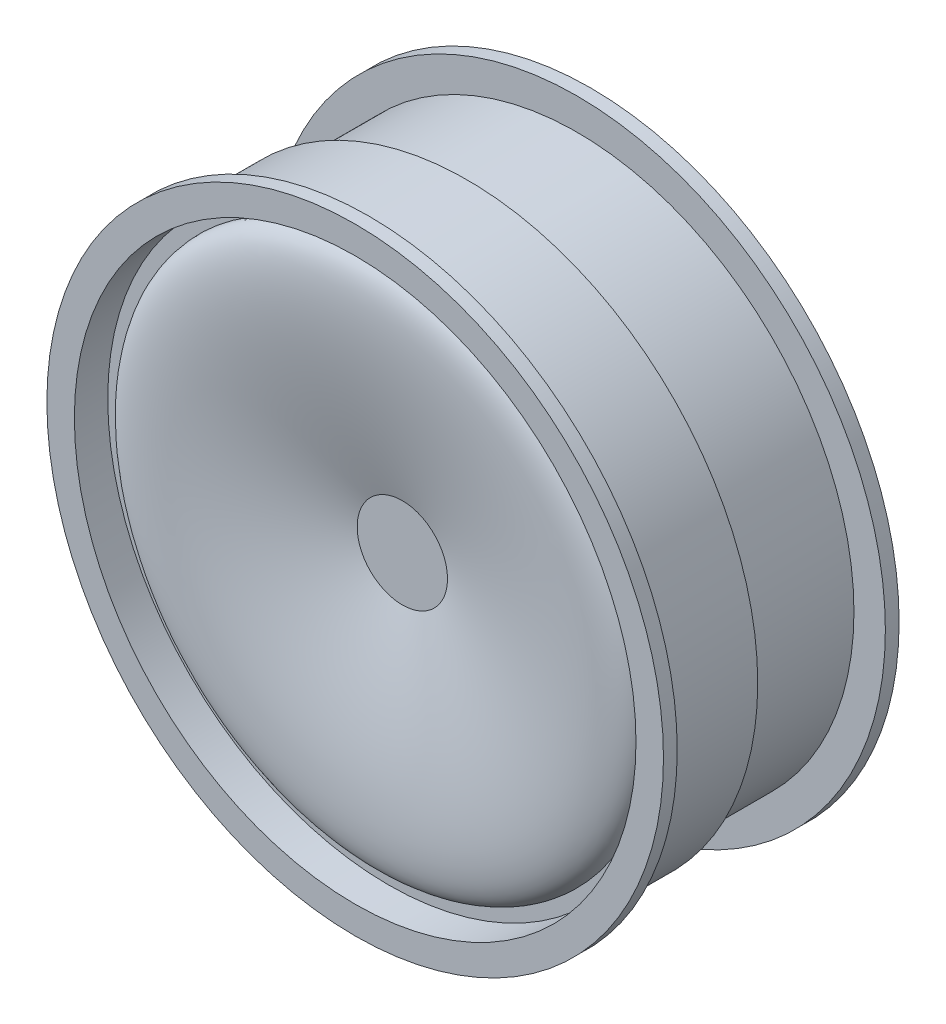
ISO-10303-21;
HEADER;
FILE_DESCRIPTION(('STEP AP214'),'2;1');
FILE_NAME('part.step','',(''),(''),'','','');
FILE_SCHEMA(('AUTOMOTIVE_DESIGN { 1 0 10303 214 1 1 1 1 }'));
ENDSEC;
DATA;
#1=APPLICATION_CONTEXT('core data for automotive mechanical design processes');
#2=APPLICATION_PROTOCOL_DEFINITION('international standard','automotive_design',2000,#1);
#3=PRODUCT_CONTEXT('',#1,'mechanical');
#4=PRODUCT('Part','Part','',(#3));
#5=PRODUCT_RELATED_PRODUCT_CATEGORY('part','',(#4));
#6=PRODUCT_DEFINITION_FORMATION('','',#4);
#7=PRODUCT_DEFINITION_CONTEXT('part definition',#1,'design');
#8=PRODUCT_DEFINITION('design','',#6,#7);
#9=PRODUCT_DEFINITION_SHAPE('','',#8);
#10=(LENGTH_UNIT() NAMED_UNIT(*) SI_UNIT(.MILLI.,.METRE.));
#11=(NAMED_UNIT(*) PLANE_ANGLE_UNIT() SI_UNIT($,.RADIAN.));
#12=(NAMED_UNIT(*) SI_UNIT($,.STERADIAN.) SOLID_ANGLE_UNIT());
#13=UNCERTAINTY_MEASURE_WITH_UNIT(LENGTH_MEASURE(1.E-05),#10,'distance_accuracy_value','');
#14=(GEOMETRIC_REPRESENTATION_CONTEXT(3) GLOBAL_UNCERTAINTY_ASSIGNED_CONTEXT((#13)) GLOBAL_UNIT_ASSIGNED_CONTEXT((#10,
#11,#12)) REPRESENTATION_CONTEXT('',''));
#15=CARTESIAN_POINT('',(0.,0.,0.));
#16=DIRECTION('',(0.,0.,1.));
#17=DIRECTION('',(1.,0.,0.));
#18=AXIS2_PLACEMENT_3D('',#15,#16,#17);
#19=CARTESIAN_POINT('',(0.,34.,1.75375434852594));
#20=CARTESIAN_POINT('',(0.,34.,4.));
#21=CARTESIAN_POINT('',(0.,30.,7.5));
#22=CARTESIAN_POINT('',(0.,5.75,0.));
#23=B_SPLINE_CURVE_WITH_KNOTS('',3,(#19,#20,#21,#22),.UNSPECIFIED.,.F.,.F.,(4,4),(0.,1.),.UNSPECIFIED.);
#24=CARTESIAN_POINT('',(0.,0.,0.));
#25=DIRECTION('',(0.,0.,1.));
#26=AXIS1_PLACEMENT('',#24,#25);
#27=SURFACE_OF_REVOLUTION('',#23,#26);
#28=CARTESIAN_POINT('',(0.,0.,0.));
#29=DIRECTION('',(0.,0.,1.));
#30=DIRECTION('',(1.,0.,0.));
#31=AXIS2_PLACEMENT_3D('',#28,#29,#30);
#32=CIRCLE('',#31,5.75);
#33=CARTESIAN_POINT('',(5.75,0.,0.));
#34=VERTEX_POINT('',#33);
#35=EDGE_CURVE('E10',#34,#34,#32,.T.);
#36=ORIENTED_EDGE('',*,*,#35,.F.);
#37=EDGE_LOOP('',(#36));
#38=FACE_BOUND('',#37,.T.);
#39=CARTESIAN_POINT('',(0.,0.,1.75375434852594));
#40=DIRECTION('',(0.,0.,1.));
#41=DIRECTION('',(1.,0.,0.));
#42=AXIS2_PLACEMENT_3D('',#39,#40,#41);
#43=CIRCLE('',#42,34.);
#44=CARTESIAN_POINT('',(34.,0.,1.75375434852594));
#45=VERTEX_POINT('',#44);
#46=EDGE_CURVE('E81',#45,#45,#43,.T.);
#47=ORIENTED_EDGE('',*,*,#46,.T.);
#48=EDGE_LOOP('',(#47));
#49=FACE_BOUND('',#48,.T.);
#50=ADVANCED_FACE('F31',(#38,#49),#27,.T.);
#51=CARTESIAN_POINT('',(0.,5.75,0.));
#52=DIRECTION('',(0.,0.,-1.));
#53=DIRECTION('',(-1.,0.,0.));
#54=AXIS2_PLACEMENT_3D('',#51,#52,#53);
#55=PLANE('',#54);
#56=ORIENTED_EDGE('',*,*,#35,.T.);
#57=EDGE_LOOP('',(#56));
#58=FACE_BOUND('',#57,.T.);
#59=ADVANCED_FACE('F103',(#58),#55,.F.);
#60=CARTESIAN_POINT('',(0.,0.,-2.20876288659794));
#61=DIRECTION('',(0.,0.,1.));
#62=DIRECTION('',(1.,0.,0.));
#63=AXIS2_PLACEMENT_3D('',#60,#61,#62);
#64=PLANE('',#63);
#65=CARTESIAN_POINT('',(0.,0.,-2.20876288659794));
#66=DIRECTION('',(0.,0.,1.));
#67=DIRECTION('',(1.,0.,0.));
#68=AXIS2_PLACEMENT_3D('',#65,#66,#67);
#69=CIRCLE('',#68,7.5);
#70=CARTESIAN_POINT('',(7.5,0.,-2.20876288659794));
#71=VERTEX_POINT('',#70);
#72=EDGE_CURVE('E38',#71,#71,#69,.T.);
#73=ORIENTED_EDGE('',*,*,#72,.F.);
#74=EDGE_LOOP('',(#73));
#75=FACE_BOUND('',#74,.T.);
#76=ADVANCED_FACE('F99',(#75),#64,.F.);
#77=CARTESIAN_POINT('',(0.,7.5,-2.20876288659794));
#78=CARTESIAN_POINT('',(0.,30.,4.75));
#79=CARTESIAN_POINT('',(0.,32.5,2.));
#80=CARTESIAN_POINT('',(0.,32.5,-1.24624565147407));
#81=B_SPLINE_CURVE_WITH_KNOTS('',3,(#77,#78,#79,#80),.UNSPECIFIED.,.F.,.F.,(4,4),(0.,1.),.UNSPECIFIED.);
#82=CARTESIAN_POINT('',(0.,0.,0.));
#83=DIRECTION('',(0.,0.,1.));
#84=AXIS1_PLACEMENT('',#82,#83);
#85=SURFACE_OF_REVOLUTION('',#81,#84);
#86=CARTESIAN_POINT('',(0.,0.,-1.24624565147407));
#87=DIRECTION('',(0.,0.,1.));
#88=DIRECTION('',(1.,0.,0.));
#89=AXIS2_PLACEMENT_3D('',#86,#87,#88);
#90=CIRCLE('',#89,32.5);
#91=CARTESIAN_POINT('',(32.5,0.,-1.24624565147407));
#92=VERTEX_POINT('',#91);
#93=EDGE_CURVE('E42',#92,#92,#90,.T.);
#94=ORIENTED_EDGE('',*,*,#93,.F.);
#95=EDGE_LOOP('',(#94));
#96=FACE_BOUND('',#95,.T.);
#97=ORIENTED_EDGE('',*,*,#72,.T.);
#98=EDGE_LOOP('',(#97));
#99=FACE_BOUND('',#98,.T.);
#100=ADVANCED_FACE('F94',(#96,#99),#85,.T.);
#101=CARTESIAN_POINT('',(0.,0.,0.));
#102=DIRECTION('',(0.,0.,1.));
#103=DIRECTION('',(1.,0.,0.));
#104=AXIS2_PLACEMENT_3D('',#101,#102,#103);
#105=CYLINDRICAL_SURFACE('',#104,32.5);
#106=CARTESIAN_POINT('',(0.,0.,-23.9962456514741));
#107=DIRECTION('',(0.,0.,1.));
#108=DIRECTION('',(1.,0.,0.));
#109=AXIS2_PLACEMENT_3D('',#106,#107,#108);
#110=CIRCLE('',#109,32.5);
#111=CARTESIAN_POINT('',(32.5,0.,-23.9962456514741));
#112=VERTEX_POINT('',#111);
#113=EDGE_CURVE('E46',#112,#112,#110,.T.);
#114=ORIENTED_EDGE('',*,*,#113,.F.);
#115=EDGE_LOOP('',(#114));
#116=FACE_BOUND('',#115,.T.);
#117=ORIENTED_EDGE('',*,*,#93,.T.);
#118=EDGE_LOOP('',(#117));
#119=FACE_BOUND('',#118,.T.);
#120=ADVANCED_FACE('F98',(#116,#119),#105,.F.);
#121=CARTESIAN_POINT('',(0.,39.25,-23.9962456514741));
#122=DIRECTION('',(0.,0.,1.));
#123=DIRECTION('',(1.,0.,0.));
#124=AXIS2_PLACEMENT_3D('',#121,#122,#123);
#125=PLANE('',#124);
#126=CARTESIAN_POINT('',(0.,0.,-23.9962456514741));
#127=DIRECTION('',(0.,0.,1.));
#128=DIRECTION('',(1.,0.,0.));
#129=AXIS2_PLACEMENT_3D('',#126,#127,#128);
#130=CIRCLE('',#129,39.25);
#131=CARTESIAN_POINT('',(39.25,0.,-23.9962456514741));
#132=VERTEX_POINT('',#131);
#133=EDGE_CURVE('E51',#132,#132,#130,.T.);
#134=ORIENTED_EDGE('',*,*,#133,.F.);
#135=EDGE_LOOP('',(#134));
#136=FACE_BOUND('',#135,.T.);
#137=ORIENTED_EDGE('',*,*,#113,.T.);
#138=EDGE_LOOP('',(#137));
#139=FACE_BOUND('',#138,.T.);
#140=ADVANCED_FACE('F172',(#136,#139),#125,.F.);
#141=CARTESIAN_POINT('',(0.,0.,0.));
#142=DIRECTION('',(0.,0.,1.));
#143=DIRECTION('',(1.,0.,0.));
#144=AXIS2_PLACEMENT_3D('',#141,#142,#143);
#145=CYLINDRICAL_SURFACE('',#144,39.25);
#146=CARTESIAN_POINT('',(0.,0.,-22.2462456514741));
#147=DIRECTION('',(0.,0.,1.));
#148=DIRECTION('',(1.,0.,0.));
#149=AXIS2_PLACEMENT_3D('',#146,#147,#148);
#150=CIRCLE('',#149,39.25);
#151=CARTESIAN_POINT('',(39.25,0.,-22.2462456514741));
#152=VERTEX_POINT('',#151);
#153=EDGE_CURVE('E54',#152,#152,#150,.T.);
#154=ORIENTED_EDGE('',*,*,#153,.F.);
#155=EDGE_LOOP('',(#154));
#156=FACE_BOUND('',#155,.T.);
#157=ORIENTED_EDGE('',*,*,#133,.T.);
#158=EDGE_LOOP('',(#157));
#159=FACE_BOUND('',#158,.T.);
#160=ADVANCED_FACE('F166',(#156,#159),#145,.T.);
#161=CARTESIAN_POINT('',(0.,35.25,-22.2462456514741));
#162=DIRECTION('',(0.,0.,-1.));
#163=DIRECTION('',(-1.,0.,0.));
#164=AXIS2_PLACEMENT_3D('',#161,#162,#163);
#165=PLANE('',#164);
#166=CARTESIAN_POINT('',(0.,0.,-22.2462456514741));
#167=DIRECTION('',(0.,0.,1.));
#168=DIRECTION('',(1.,0.,0.));
#169=AXIS2_PLACEMENT_3D('',#166,#167,#168);
#170=CIRCLE('',#169,35.25);
#171=CARTESIAN_POINT('',(35.25,0.,-22.2462456514741));
#172=VERTEX_POINT('',#171);
#173=EDGE_CURVE('E57',#172,#172,#170,.T.);
#174=ORIENTED_EDGE('',*,*,#173,.F.);
#175=EDGE_LOOP('',(#174));
#176=FACE_BOUND('',#175,.T.);
#177=ORIENTED_EDGE('',*,*,#153,.T.);
#178=EDGE_LOOP('',(#177));
#179=FACE_BOUND('',#178,.T.);
#180=ADVANCED_FACE('F160',(#176,#179),#165,.F.);
#181=CARTESIAN_POINT('',(0.,0.,0.));
#182=DIRECTION('',(0.,0.,1.));
#183=DIRECTION('',(1.,0.,0.));
#184=AXIS2_PLACEMENT_3D('',#181,#182,#183);
#185=CYLINDRICAL_SURFACE('',#184,35.25);
#186=CARTESIAN_POINT('',(0.,0.,-8.24624565147406));
#187=DIRECTION('',(0.,0.,1.));
#188=DIRECTION('',(1.,0.,0.));
#189=AXIS2_PLACEMENT_3D('',#186,#187,#188);
#190=CIRCLE('',#189,35.25);
#191=CARTESIAN_POINT('',(35.25,0.,-8.24624565147406));
#192=VERTEX_POINT('',#191);
#193=EDGE_CURVE('E60',#192,#192,#190,.T.);
#194=ORIENTED_EDGE('',*,*,#193,.F.);
#195=EDGE_LOOP('',(#194));
#196=FACE_BOUND('',#195,.T.);
#197=ORIENTED_EDGE('',*,*,#173,.T.);
#198=EDGE_LOOP('',(#197));
#199=FACE_BOUND('',#198,.T.);
#200=ADVANCED_FACE('F154',(#196,#199),#185,.T.);
#201=CARTESIAN_POINT('',(0.,37.,-8.24624565147406));
#202=DIRECTION('',(0.,0.,1.));
#203=DIRECTION('',(1.,0.,0.));
#204=AXIS2_PLACEMENT_3D('',#201,#202,#203);
#205=PLANE('',#204);
#206=CARTESIAN_POINT('',(0.,0.,-8.24624565147406));
#207=DIRECTION('',(0.,0.,1.));
#208=DIRECTION('',(1.,0.,0.));
#209=AXIS2_PLACEMENT_3D('',#206,#207,#208);
#210=CIRCLE('',#209,37.);
#211=CARTESIAN_POINT('',(37.,0.,-8.24624565147406));
#212=VERTEX_POINT('',#211);
#213=EDGE_CURVE('E63',#212,#212,#210,.T.);
#214=ORIENTED_EDGE('',*,*,#213,.F.);
#215=EDGE_LOOP('',(#214));
#216=FACE_BOUND('',#215,.T.);
#217=ORIENTED_EDGE('',*,*,#193,.T.);
#218=EDGE_LOOP('',(#217));
#219=FACE_BOUND('',#218,.T.);
#220=ADVANCED_FACE('F148',(#216,#219),#205,.F.);
#221=CARTESIAN_POINT('',(0.,0.,0.));
#222=DIRECTION('',(0.,0.,1.));
#223=DIRECTION('',(1.,0.,0.));
#224=AXIS2_PLACEMENT_3D('',#221,#222,#223);
#225=CYLINDRICAL_SURFACE('',#224,37.);
#226=CARTESIAN_POINT('',(0.,0.,4.25375434852594));
#227=DIRECTION('',(0.,0.,1.));
#228=DIRECTION('',(1.,0.,0.));
#229=AXIS2_PLACEMENT_3D('',#226,#227,#228);
#230=CIRCLE('',#229,37.);
#231=CARTESIAN_POINT('',(37.,0.,4.25375434852594));
#232=VERTEX_POINT('',#231);
#233=EDGE_CURVE('E66',#232,#232,#230,.T.);
#234=ORIENTED_EDGE('',*,*,#233,.F.);
#235=EDGE_LOOP('',(#234));
#236=FACE_BOUND('',#235,.T.);
#237=ORIENTED_EDGE('',*,*,#213,.T.);
#238=EDGE_LOOP('',(#237));
#239=FACE_BOUND('',#238,.T.);
#240=ADVANCED_FACE('F142',(#236,#239),#225,.T.);
#241=CARTESIAN_POINT('',(0.,39.25,4.25375434852594));
#242=DIRECTION('',(0.,0.,1.));
#243=DIRECTION('',(1.,0.,0.));
#244=AXIS2_PLACEMENT_3D('',#241,#242,#243);
#245=PLANE('',#244);
#246=CARTESIAN_POINT('',(0.,0.,4.25375434852594));
#247=DIRECTION('',(0.,0.,1.));
#248=DIRECTION('',(1.,0.,0.));
#249=AXIS2_PLACEMENT_3D('',#246,#247,#248);
#250=CIRCLE('',#249,39.25);
#251=CARTESIAN_POINT('',(39.25,0.,4.25375434852594));
#252=VERTEX_POINT('',#251);
#253=EDGE_CURVE('E69',#252,#252,#250,.T.);
#254=ORIENTED_EDGE('',*,*,#253,.F.);
#255=EDGE_LOOP('',(#254));
#256=FACE_BOUND('',#255,.T.);
#257=ORIENTED_EDGE('',*,*,#233,.T.);
#258=EDGE_LOOP('',(#257));
#259=FACE_BOUND('',#258,.T.);
#260=ADVANCED_FACE('F136',(#256,#259),#245,.F.);
#261=CARTESIAN_POINT('',(0.,0.,0.));
#262=DIRECTION('',(0.,0.,1.));
#263=DIRECTION('',(1.,0.,0.));
#264=AXIS2_PLACEMENT_3D('',#261,#262,#263);
#265=CYLINDRICAL_SURFACE('',#264,39.25);
#266=CARTESIAN_POINT('',(0.,0.,6.00375434852594));
#267=DIRECTION('',(0.,0.,1.));
#268=DIRECTION('',(1.,0.,0.));
#269=AXIS2_PLACEMENT_3D('',#266,#267,#268);
#270=CIRCLE('',#269,39.25);
#271=CARTESIAN_POINT('',(39.25,0.,6.00375434852594));
#272=VERTEX_POINT('',#271);
#273=EDGE_CURVE('E72',#272,#272,#270,.T.);
#274=ORIENTED_EDGE('',*,*,#273,.F.);
#275=EDGE_LOOP('',(#274));
#276=FACE_BOUND('',#275,.T.);
#277=ORIENTED_EDGE('',*,*,#253,.T.);
#278=EDGE_LOOP('',(#277));
#279=FACE_BOUND('',#278,.T.);
#280=ADVANCED_FACE('F130',(#276,#279),#265,.T.);
#281=CARTESIAN_POINT('',(0.,35.75,6.00375434852594));
#282=DIRECTION('',(0.,0.,-1.));
#283=DIRECTION('',(-1.,0.,0.));
#284=AXIS2_PLACEMENT_3D('',#281,#282,#283);
#285=PLANE('',#284);
#286=CARTESIAN_POINT('',(0.,0.,6.00375434852594));
#287=DIRECTION('',(0.,0.,1.));
#288=DIRECTION('',(1.,0.,0.));
#289=AXIS2_PLACEMENT_3D('',#286,#287,#288);
#290=CIRCLE('',#289,35.75);
#291=CARTESIAN_POINT('',(35.75,0.,6.00375434852594));
#292=VERTEX_POINT('',#291);
#293=EDGE_CURVE('E75',#292,#292,#290,.T.);
#294=ORIENTED_EDGE('',*,*,#293,.F.);
#295=EDGE_LOOP('',(#294));
#296=FACE_BOUND('',#295,.T.);
#297=ORIENTED_EDGE('',*,*,#273,.T.);
#298=EDGE_LOOP('',(#297));
#299=FACE_BOUND('',#298,.T.);
#300=ADVANCED_FACE('F124',(#296,#299),#285,.F.);
#301=CARTESIAN_POINT('',(0.,0.,0.));
#302=DIRECTION('',(0.,0.,1.));
#303=DIRECTION('',(1.,0.,0.));
#304=AXIS2_PLACEMENT_3D('',#301,#302,#303);
#305=CYLINDRICAL_SURFACE('',#304,35.75);
#306=CARTESIAN_POINT('',(0.,0.,1.75375434852594));
#307=DIRECTION('',(0.,0.,1.));
#308=DIRECTION('',(1.,0.,0.));
#309=AXIS2_PLACEMENT_3D('',#306,#307,#308);
#310=CIRCLE('',#309,35.75);
#311=CARTESIAN_POINT('',(35.75,0.,1.75375434852594));
#312=VERTEX_POINT('',#311);
#313=EDGE_CURVE('E78',#312,#312,#310,.T.);
#314=ORIENTED_EDGE('',*,*,#313,.F.);
#315=EDGE_LOOP('',(#314));
#316=FACE_BOUND('',#315,.T.);
#317=ORIENTED_EDGE('',*,*,#293,.T.);
#318=EDGE_LOOP('',(#317));
#319=FACE_BOUND('',#318,.T.);
#320=ADVANCED_FACE('F118',(#316,#319),#305,.F.);
#321=CARTESIAN_POINT('',(0.,34.,1.75375434852594));
#322=DIRECTION('',(0.,0.,-1.));
#323=DIRECTION('',(-1.,0.,0.));
#324=AXIS2_PLACEMENT_3D('',#321,#322,#323);
#325=PLANE('',#324);
#326=ORIENTED_EDGE('',*,*,#46,.F.);
#327=EDGE_LOOP('',(#326));
#328=FACE_BOUND('',#327,.T.);
#329=ORIENTED_EDGE('',*,*,#313,.T.);
#330=EDGE_LOOP('',(#329));
#331=FACE_BOUND('',#330,.T.);
#332=ADVANCED_FACE('F115',(#328,#331),#325,.F.);
#333=CLOSED_SHELL('',(#50,#59,#76,#100,#120,#140,#160,#180,#200,#220,#240,#260,#280,#300,#320,#332));
#334=MANIFOLD_SOLID_BREP('B2',#333);
#335=ADVANCED_BREP_SHAPE_REPRESENTATION('',(#18,#334),#14);
#336=SHAPE_DEFINITION_REPRESENTATION(#9,#335);
ENDSEC;
END-ISO-10303-21;
